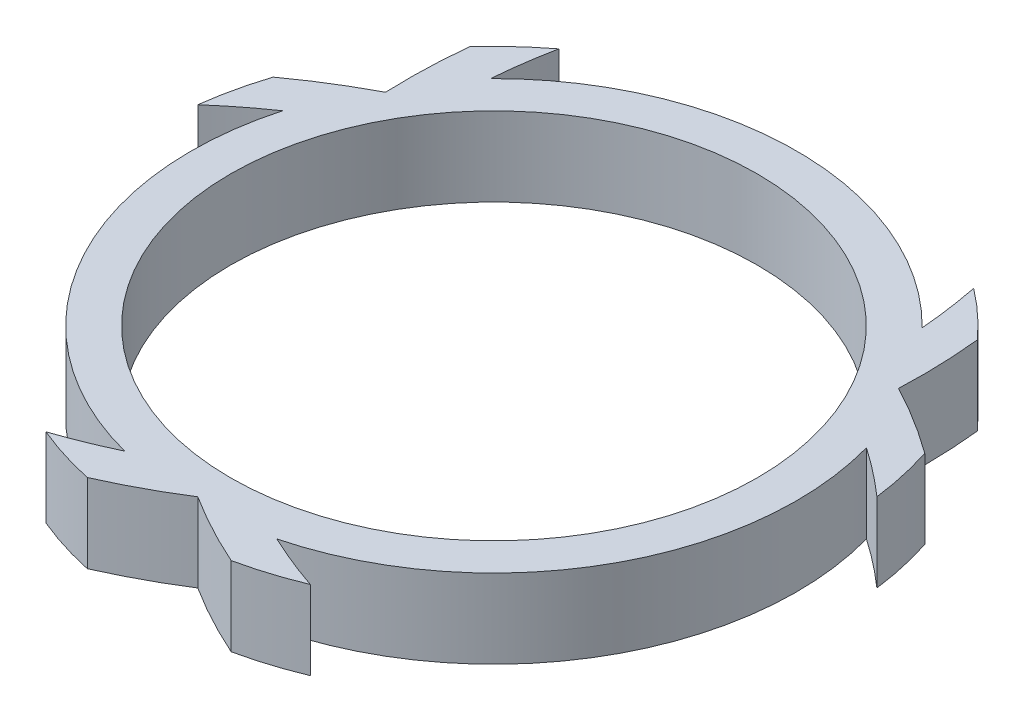
ISO-10303-21;
HEADER;
FILE_DESCRIPTION(('STEP AP214'),'2;1');
FILE_NAME('part.step','',(''),(''),'','','');
FILE_SCHEMA(('AUTOMOTIVE_DESIGN { 1 0 10303 214 1 1 1 1 }'));
ENDSEC;
DATA;
#1=APPLICATION_CONTEXT('core data for automotive mechanical design processes');
#2=APPLICATION_PROTOCOL_DEFINITION('international standard','automotive_design',2000,#1);
#3=PRODUCT_CONTEXT('',#1,'mechanical');
#4=PRODUCT('Part','Part','',(#3));
#5=PRODUCT_RELATED_PRODUCT_CATEGORY('part','',(#4));
#6=PRODUCT_DEFINITION_FORMATION('','',#4);
#7=PRODUCT_DEFINITION_CONTEXT('part definition',#1,'design');
#8=PRODUCT_DEFINITION('design','',#6,#7);
#9=PRODUCT_DEFINITION_SHAPE('','',#8);
#10=(LENGTH_UNIT() NAMED_UNIT(*) SI_UNIT(.MILLI.,.METRE.));
#11=(NAMED_UNIT(*) PLANE_ANGLE_UNIT() SI_UNIT($,.RADIAN.));
#12=(NAMED_UNIT(*) SI_UNIT($,.STERADIAN.) SOLID_ANGLE_UNIT());
#13=UNCERTAINTY_MEASURE_WITH_UNIT(LENGTH_MEASURE(1.E-05),#10,'distance_accuracy_value','');
#14=(GEOMETRIC_REPRESENTATION_CONTEXT(3) GLOBAL_UNCERTAINTY_ASSIGNED_CONTEXT((#13)) GLOBAL_UNIT_ASSIGNED_CONTEXT((#10,
#11,#12)) REPRESENTATION_CONTEXT('',''));
#15=CARTESIAN_POINT('',(0.,0.,0.));
#16=DIRECTION('',(0.,0.,1.));
#17=DIRECTION('',(1.,0.,0.));
#18=AXIS2_PLACEMENT_3D('',#15,#16,#17);
#19=CARTESIAN_POINT('',(-13.01,3.,-50.0940107675848));
#20=DIRECTION('',(0.,-1.,0.));
#21=DIRECTION('',(0.,0.,-1.));
#22=AXIS2_PLACEMENT_3D('',#19,#20,#21);
#23=PLANE('',#22);
#24=CARTESIAN_POINT('',(0.,3.,-63.0940107675848));
#25=DIRECTION('',(0.,1.,0.));
#26=DIRECTION('',(0.,0.,1.));
#27=AXIS2_PLACEMENT_3D('',#24,#25,#26);
#28=CIRCLE('',#27,11.5);
#29=CARTESIAN_POINT('',(11.08445734716,3.,-66.1574737294939));
#30=VERTEX_POINT('',#29);
#31=CARTESIAN_POINT('',(2.88919192501457,3.,-51.9628576368248));
#32=VERTEX_POINT('',#31);
#33=EDGE_CURVE('E47',#30,#32,#28,.F.);
#34=ORIENTED_EDGE('',*,*,#33,.T.);
#35=CARTESIAN_POINT('',(11.2583302491977,3.,-69.594010767585));
#36=DIRECTION('',(0.,1.,0.));
#37=DIRECTION('',(0.,0.,1.));
#38=AXIS2_PLACEMENT_3D('',#35,#36,#37);
#39=CIRCLE('',#38,19.5166604983954);
#40=CARTESIAN_POINT('',(5.01848841913951,3.,-51.1017310015453));
#41=VERTEX_POINT('',#40);
#42=EDGE_CURVE('E234',#32,#41,#39,.T.);
#43=ORIENTED_EDGE('',*,*,#42,.T.);
#44=CARTESIAN_POINT('',(0.,3.,-63.0940107675848));
#45=DIRECTION('',(0.,-1.,0.));
#46=DIRECTION('',(0.,0.,-1.));
#47=AXIS2_PLACEMENT_3D('',#44,#45,#46);
#48=CIRCLE('',#47,13.);
#49=CARTESIAN_POINT('',(2.73241138031824,3.,-50.3844109293245));
#50=VERTEX_POINT('',#49);
#51=EDGE_CURVE('E284',#50,#41,#48,.F.);
#52=ORIENTED_EDGE('',*,*,#51,.F.);
#53=CARTESIAN_POINT('',(11.2583302491977,3.,-69.594010767585));
#54=DIRECTION('',(0.,1.,0.));
#55=DIRECTION('',(0.,0.,1.));
#56=AXIS2_PLACEMENT_3D('',#53,#54,#55);
#57=CIRCLE('',#56,21.0166604983954);
#58=CARTESIAN_POINT('',(0.,3.,-51.8471795432562));
#59=VERTEX_POINT('',#58);
#60=EDGE_CURVE('E316',#59,#50,#57,.T.);
#61=ORIENTED_EDGE('',*,*,#60,.F.);
#62=CARTESIAN_POINT('',(-11.2583302491977,3.,-69.594010767585));
#63=DIRECTION('',(0.,1.,0.));
#64=DIRECTION('',(0.,0.,1.));
#65=AXIS2_PLACEMENT_3D('',#62,#63,#64);
#66=CIRCLE('',#65,21.0166604983954);
#67=CARTESIAN_POINT('',(-2.73241138031828,3.,-50.3844109293245));
#68=VERTEX_POINT('',#67);
#69=EDGE_CURVE('E297',#68,#59,#66,.T.);
#70=ORIENTED_EDGE('',*,*,#69,.F.);
#71=CARTESIAN_POINT('',(-5.01848841913956,3.,-51.1017310015452));
#72=VERTEX_POINT('',#71);
#73=EDGE_CURVE('E210',#72,#68,#48,.F.);
#74=ORIENTED_EDGE('',*,*,#73,.F.);
#75=CARTESIAN_POINT('',(-11.2583302491977,3.,-69.594010767585));
#76=DIRECTION('',(0.,1.,0.));
#77=DIRECTION('',(0.,0.,1.));
#78=AXIS2_PLACEMENT_3D('',#75,#76,#77);
#79=CIRCLE('',#78,19.5166604983954);
#80=CARTESIAN_POINT('',(-2.88919192501458,3.,-51.9628576368248));
#81=VERTEX_POINT('',#80);
#82=EDGE_CURVE('E255',#72,#81,#79,.T.);
#83=ORIENTED_EDGE('',*,*,#82,.T.);
#84=CARTESIAN_POINT('',(0.,3.,-63.0940107675848));
#85=DIRECTION('',(0.,1.,0.));
#86=DIRECTION('',(0.,0.,1.));
#87=AXIS2_PLACEMENT_3D('',#84,#85,#86);
#88=CIRCLE('',#87,11.4999999999999);
#89=CARTESIAN_POINT('',(-11.0844573471601,3.,-66.1574737294938));
#90=VERTEX_POINT('',#89);
#91=EDGE_CURVE('E217',#81,#90,#88,.F.);
#92=ORIENTED_EDGE('',*,*,#91,.T.);
#93=CARTESIAN_POINT('',(0.,3.,-50.094010767585));
#94=DIRECTION('',(0.,1.,0.));
#95=DIRECTION('',(0.,0.,1.));
#96=AXIS2_PLACEMENT_3D('',#93,#94,#95);
#97=CIRCLE('',#96,19.5166604983954);
#98=CARTESIAN_POINT('',(-12.8948631362501,3.,-64.7440121910322));
#99=VERTEX_POINT('',#98);
#100=EDGE_CURVE('E195',#90,#99,#97,.T.);
#101=ORIENTED_EDGE('',*,*,#100,.T.);
#102=CARTESIAN_POINT('',(-12.3730420220271,3.,-67.0824730177702));
#103=VERTEX_POINT('',#102);
#104=EDGE_CURVE('E206',#103,#99,#48,.F.);
#105=ORIENTED_EDGE('',*,*,#104,.F.);
#106=CARTESIAN_POINT('',(0.,3.,-50.094010767585));
#107=DIRECTION('',(0.,1.,0.));
#108=DIRECTION('',(0.,0.,1.));
#109=AXIS2_PLACEMENT_3D('',#106,#107,#108);
#110=CIRCLE('',#109,21.0166604983954);
#111=CARTESIAN_POINT('',(-9.74004155234485,3.,-68.7174263797494));
#112=VERTEX_POINT('',#111);
#113=EDGE_CURVE('E295',#112,#103,#110,.T.);
#114=ORIENTED_EDGE('',*,*,#113,.F.);
#115=CARTESIAN_POINT('',(11.2583302491977,3.,-69.594010767585));
#116=DIRECTION('',(0.,1.,0.));
#117=DIRECTION('',(0.,0.,1.));
#118=AXIS2_PLACEMENT_3D('',#115,#116,#117);
#119=CIRCLE('',#118,21.0166604983954);
#120=CARTESIAN_POINT('',(-9.64063064170916,3.,-71.8151483556601));
#121=VERTEX_POINT('',#120);
#122=EDGE_CURVE('E68',#121,#112,#119,.T.);
#123=ORIENTED_EDGE('',*,*,#122,.F.);
#124=CARTESIAN_POINT('',(-7.87637471711089,3.,-73.4362891101773));
#125=VERTEX_POINT('',#124);
#126=EDGE_CURVE('E211',#125,#121,#48,.F.);
#127=ORIENTED_EDGE('',*,*,#126,.F.);
#128=CARTESIAN_POINT('',(11.2583302491977,3.,-69.594010767585));
#129=DIRECTION('',(0.,1.,0.));
#130=DIRECTION('',(0.,0.,1.));
#131=AXIS2_PLACEMENT_3D('',#128,#129,#130);
#132=CIRCLE('',#131,19.5166604983954);
#133=CARTESIAN_POINT('',(-8.19526542214581,3.,-71.1617009364364));
#134=VERTEX_POINT('',#133);
#135=EDGE_CURVE('E218',#125,#134,#132,.T.);
#136=ORIENTED_EDGE('',*,*,#135,.T.);
#137=CARTESIAN_POINT('',(0.,3.,-63.0940107675848));
#138=DIRECTION('',(0.,1.,0.));
#139=DIRECTION('',(0.,0.,1.));
#140=AXIS2_PLACEMENT_3D('',#137,#138,#139);
#141=CIRCLE('',#140,11.5000000000001);
#142=CARTESIAN_POINT('',(8.19526542214578,3.,-71.1617009364363));
#143=VERTEX_POINT('',#142);
#144=EDGE_CURVE('E223',#134,#143,#141,.F.);
#145=ORIENTED_EDGE('',*,*,#144,.T.);
#146=CARTESIAN_POINT('',(-11.2583302491977,3.,-69.594010767585));
#147=DIRECTION('',(0.,1.,0.));
#148=DIRECTION('',(0.,0.,1.));
#149=AXIS2_PLACEMENT_3D('',#146,#147,#148);
#150=CIRCLE('',#149,19.5166604983954);
#151=CARTESIAN_POINT('',(7.87637471711086,3.,-73.4362891101772));
#152=VERTEX_POINT('',#151);
#153=EDGE_CURVE('E221',#143,#152,#150,.T.);
#154=ORIENTED_EDGE('',*,*,#153,.T.);
#155=CARTESIAN_POINT('',(9.64063064170913,3.,-71.81514835566));
#156=VERTEX_POINT('',#155);
#157=EDGE_CURVE('E262',#156,#152,#48,.F.);
#158=ORIENTED_EDGE('',*,*,#157,.F.);
#159=CARTESIAN_POINT('',(-11.2583302491977,3.,-69.594010767585));
#160=DIRECTION('',(0.,1.,0.));
#161=DIRECTION('',(0.,0.,1.));
#162=AXIS2_PLACEMENT_3D('',#159,#160,#161);
#163=CIRCLE('',#162,21.0166604983954);
#164=CARTESIAN_POINT('',(9.74004155234482,3.,-68.7174263797495));
#165=VERTEX_POINT('',#164);
#166=EDGE_CURVE('E293',#165,#156,#163,.T.);
#167=ORIENTED_EDGE('',*,*,#166,.F.);
#168=CARTESIAN_POINT('',(0.,3.,-50.094010767585));
#169=DIRECTION('',(0.,1.,0.));
#170=DIRECTION('',(0.,0.,1.));
#171=AXIS2_PLACEMENT_3D('',#168,#169,#170);
#172=CIRCLE('',#171,21.0166604983954);
#173=CARTESIAN_POINT('',(12.373042022027,3.,-67.0824730177702));
#174=VERTEX_POINT('',#173);
#175=EDGE_CURVE('E313',#174,#165,#172,.T.);
#176=ORIENTED_EDGE('',*,*,#175,.F.);
#177=CARTESIAN_POINT('',(12.89486313625,3.,-64.7440121910323));
#178=VERTEX_POINT('',#177);
#179=EDGE_CURVE('E279',#178,#174,#48,.F.);
#180=ORIENTED_EDGE('',*,*,#179,.F.);
#181=CARTESIAN_POINT('',(0.,3.,-50.094010767585));
#182=DIRECTION('',(0.,1.,0.));
#183=DIRECTION('',(0.,0.,1.));
#184=AXIS2_PLACEMENT_3D('',#181,#182,#183);
#185=CIRCLE('',#184,19.5166604983954);
#186=EDGE_CURVE('E237',#178,#30,#185,.T.);
#187=ORIENTED_EDGE('',*,*,#186,.T.);
#188=EDGE_LOOP('',(#34,#43,#52,#61,#70,#74,#83,#92,#101,#105,#114,#123,#127,#136,#145,#154,#158,
#167,#176,#180,#187));
#189=FACE_BOUND('',#188,.T.);
#190=CARTESIAN_POINT('',(0.,3.,-63.0940107675848));
#191=DIRECTION('',(0.,-1.,0.));
#192=DIRECTION('',(0.,0.,-1.));
#193=AXIS2_PLACEMENT_3D('',#190,#191,#192);
#194=CIRCLE('',#193,10.);
#195=CARTESIAN_POINT('',(0.,3.,-73.0940107675848));
#196=VERTEX_POINT('',#195);
#197=EDGE_CURVE('E278',#196,#196,#194,.T.);
#198=ORIENTED_EDGE('',*,*,#197,.F.);
#199=EDGE_LOOP('',(#198));
#200=FACE_BOUND('',#199,.T.);
#201=ADVANCED_FACE('F43',(#189,#200),#23,.T.);
#202=CARTESIAN_POINT('',(0.,-12.01,-63.0940107675848));
#203=DIRECTION('',(0.,1.,0.));
#204=DIRECTION('',(0.,0.,1.));
#205=AXIS2_PLACEMENT_3D('',#202,#203,#204);
#206=CYLINDRICAL_SURFACE('',#205,13.);
#207=DIRECTION('',(0.,1.,0.));
#208=VECTOR('',#207,1.);
#209=CARTESIAN_POINT('',(12.89486313625,-3.005,-64.7440121910323));
#210=LINE('',#209,#208);
#211=CARTESIAN_POINT('',(12.89486313625,6.,-64.7440121910323));
#212=VERTEX_POINT('',#211);
#213=EDGE_CURVE('E274',#178,#212,#210,.T.);
#214=ORIENTED_EDGE('',*,*,#213,.F.);
#215=ORIENTED_EDGE('',*,*,#179,.T.);
#216=DIRECTION('',(0.,1.,0.));
#217=VECTOR('',#216,1.);
#218=CARTESIAN_POINT('',(12.373042022027,-3.005,-67.0824730177702));
#219=LINE('',#218,#217);
#220=CARTESIAN_POINT('',(12.373042022027,6.,-67.0824730177702));
#221=VERTEX_POINT('',#220);
#222=EDGE_CURVE('E351',#174,#221,#219,.T.);
#223=ORIENTED_EDGE('',*,*,#222,.T.);
#224=CARTESIAN_POINT('',(0.,6.,-63.0940107675848));
#225=DIRECTION('',(0.,1.,0.));
#226=DIRECTION('',(0.,0.,1.));
#227=AXIS2_PLACEMENT_3D('',#224,#225,#226);
#228=CIRCLE('',#227,13.);
#229=EDGE_CURVE('E375',#212,#221,#228,.T.);
#230=ORIENTED_EDGE('',*,*,#229,.F.);
#231=EDGE_LOOP('',(#214,#215,#223,#230));
#232=FACE_BOUND('',#231,.T.);
#233=ADVANCED_FACE('F389',(#232),#206,.T.);
#234=CARTESIAN_POINT('',(0.,6.,-50.094010767585));
#235=DIRECTION('',(0.,-1.,0.));
#236=DIRECTION('',(0.,0.,-1.));
#237=AXIS2_PLACEMENT_3D('',#234,#235,#236);
#238=CYLINDRICAL_SURFACE('',#237,21.0166604983954);
#239=DIRECTION('',(0.,1.,0.));
#240=VECTOR('',#239,1.);
#241=CARTESIAN_POINT('',(-12.3730420220271,-3.005,-67.0824730177702));
#242=LINE('',#241,#240);
#243=CARTESIAN_POINT('',(-12.3730420220271,6.,-67.0824730177702));
#244=VERTEX_POINT('',#243);
#245=EDGE_CURVE('E209',#244,#103,#242,.F.);
#246=ORIENTED_EDGE('',*,*,#245,.F.);
#247=CARTESIAN_POINT('',(0.,6.,-50.094010767585));
#248=DIRECTION('',(0.,1.,0.));
#249=DIRECTION('',(0.,0.,1.));
#250=AXIS2_PLACEMENT_3D('',#247,#248,#249);
#251=CIRCLE('',#250,21.0166604983954);
#252=CARTESIAN_POINT('',(-9.74004155234485,6.,-68.7174263797494));
#253=VERTEX_POINT('',#252);
#254=EDGE_CURVE('E292',#253,#244,#251,.T.);
#255=ORIENTED_EDGE('',*,*,#254,.F.);
#256=DIRECTION('',(0.,-1.,0.));
#257=VECTOR('',#256,1.);
#258=CARTESIAN_POINT('',(-9.74004155234485,6.,-68.7174263797494));
#259=LINE('',#258,#257);
#260=EDGE_CURVE('E290',#253,#112,#259,.T.);
#261=ORIENTED_EDGE('',*,*,#260,.T.);
#262=ORIENTED_EDGE('',*,*,#113,.T.);
#263=EDGE_LOOP('',(#246,#255,#261,#262));
#264=FACE_BOUND('',#263,.T.);
#265=ADVANCED_FACE('F299',(#264),#238,.T.);
#266=CARTESIAN_POINT('',(0.,6.,-50.094010767585));
#267=DIRECTION('',(0.,-1.,0.));
#268=DIRECTION('',(0.,0.,-1.));
#269=AXIS2_PLACEMENT_3D('',#266,#267,#268);
#270=CYLINDRICAL_SURFACE('',#269,21.0166604983954);
#271=ORIENTED_EDGE('',*,*,#222,.F.);
#272=ORIENTED_EDGE('',*,*,#175,.T.);
#273=DIRECTION('',(0.,-1.,0.));
#274=VECTOR('',#273,1.);
#275=CARTESIAN_POINT('',(9.74004155234482,6.,-68.7174263797495));
#276=LINE('',#275,#274);
#277=CARTESIAN_POINT('',(9.74004155234482,6.,-68.7174263797495));
#278=VERTEX_POINT('',#277);
#279=EDGE_CURVE('E300',#278,#165,#276,.T.);
#280=ORIENTED_EDGE('',*,*,#279,.F.);
#281=CARTESIAN_POINT('',(0.,6.,-50.094010767585));
#282=DIRECTION('',(0.,1.,0.));
#283=DIRECTION('',(0.,0.,1.));
#284=AXIS2_PLACEMENT_3D('',#281,#282,#283);
#285=CIRCLE('',#284,21.0166604983954);
#286=EDGE_CURVE('E336',#221,#278,#285,.T.);
#287=ORIENTED_EDGE('',*,*,#286,.F.);
#288=EDGE_LOOP('',(#271,#272,#280,#287));
#289=FACE_BOUND('',#288,.T.);
#290=ADVANCED_FACE('F391',(#289),#270,.T.);
#291=CARTESIAN_POINT('',(-11.2583302491977,6.,-69.594010767585));
#292=DIRECTION('',(0.,-1.,0.));
#293=DIRECTION('',(0.,0.,-1.));
#294=AXIS2_PLACEMENT_3D('',#291,#292,#293);
#295=CYLINDRICAL_SURFACE('',#294,21.0166604983954);
#296=DIRECTION('',(0.,1.,0.));
#297=VECTOR('',#296,1.);
#298=CARTESIAN_POINT('',(-2.73241138031828,-3.005,-50.3844109293245));
#299=LINE('',#298,#297);
#300=CARTESIAN_POINT('',(-2.73241138031828,6.,-50.3844109293245));
#301=VERTEX_POINT('',#300);
#302=EDGE_CURVE('E325',#68,#301,#299,.T.);
#303=ORIENTED_EDGE('',*,*,#302,.F.);
#304=ORIENTED_EDGE('',*,*,#69,.T.);
#305=DIRECTION('',(0.,-1.,0.));
#306=VECTOR('',#305,1.);
#307=CARTESIAN_POINT('',(0.,6.,-51.8471795432562));
#308=LINE('',#307,#306);
#309=CARTESIAN_POINT('',(0.,6.,-51.8471795432562));
#310=VERTEX_POINT('',#309);
#311=EDGE_CURVE('E303',#310,#59,#308,.T.);
#312=ORIENTED_EDGE('',*,*,#311,.F.);
#313=CARTESIAN_POINT('',(-11.2583302491977,6.,-69.594010767585));
#314=DIRECTION('',(0.,1.,0.));
#315=DIRECTION('',(0.,0.,1.));
#316=AXIS2_PLACEMENT_3D('',#313,#314,#315);
#317=CIRCLE('',#316,21.0166604983954);
#318=EDGE_CURVE('E337',#301,#310,#317,.T.);
#319=ORIENTED_EDGE('',*,*,#318,.F.);
#320=EDGE_LOOP('',(#303,#304,#312,#319));
#321=FACE_BOUND('',#320,.T.);
#322=ADVANCED_FACE('F322',(#321),#295,.T.);
#323=DIRECTION('',(0.,1.,0.));
#324=VECTOR('',#323,1.);
#325=CARTESIAN_POINT('',(9.64063064170914,-3.005,-71.81514835566));
#326=LINE('',#325,#324);
#327=CARTESIAN_POINT('',(9.64063064170913,6.,-71.81514835566));
#328=VERTEX_POINT('',#327);
#329=EDGE_CURVE('E52',#328,#156,#326,.F.);
#330=ORIENTED_EDGE('',*,*,#329,.T.);
#331=ORIENTED_EDGE('',*,*,#157,.T.);
#332=DIRECTION('',(0.,1.,0.));
#333=VECTOR('',#332,1.);
#334=CARTESIAN_POINT('',(7.87637471711086,-3.005,-73.4362891101772));
#335=LINE('',#334,#333);
#336=CARTESIAN_POINT('',(7.87637471711086,6.,-73.4362891101772));
#337=VERTEX_POINT('',#336);
#338=EDGE_CURVE('E270',#337,#152,#335,.F.);
#339=ORIENTED_EDGE('',*,*,#338,.F.);
#340=EDGE_CURVE('E394',#328,#337,#228,.T.);
#341=ORIENTED_EDGE('',*,*,#340,.F.);
#342=EDGE_LOOP('',(#330,#331,#339,#341));
#343=FACE_BOUND('',#342,.T.);
#344=ADVANCED_FACE('F276',(#343),#206,.T.);
#345=DIRECTION('',(0.,1.,0.));
#346=VECTOR('',#345,1.);
#347=CARTESIAN_POINT('',(-7.87637471711089,-3.005,-73.4362891101773));
#348=LINE('',#347,#346);
#349=CARTESIAN_POINT('',(-7.87637471711089,6.,-73.4362891101773));
#350=VERTEX_POINT('',#349);
#351=EDGE_CURVE('E201',#125,#350,#348,.T.);
#352=ORIENTED_EDGE('',*,*,#351,.F.);
#353=ORIENTED_EDGE('',*,*,#126,.T.);
#354=DIRECTION('',(0.,1.,0.));
#355=VECTOR('',#354,1.);
#356=CARTESIAN_POINT('',(-9.64063064170917,-3.005,-71.8151483556601));
#357=LINE('',#356,#355);
#358=CARTESIAN_POINT('',(-9.64063064170916,6.,-71.8151483556601));
#359=VERTEX_POINT('',#358);
#360=EDGE_CURVE('E11',#121,#359,#357,.T.);
#361=ORIENTED_EDGE('',*,*,#360,.T.);
#362=EDGE_CURVE('E396',#350,#359,#228,.T.);
#363=ORIENTED_EDGE('',*,*,#362,.F.);
#364=EDGE_LOOP('',(#352,#353,#361,#363));
#365=FACE_BOUND('',#364,.T.);
#366=ADVANCED_FACE('F45',(#365),#206,.T.);
#367=ORIENTED_EDGE('',*,*,#245,.T.);
#368=ORIENTED_EDGE('',*,*,#104,.T.);
#369=DIRECTION('',(0.,1.,0.));
#370=VECTOR('',#369,1.);
#371=CARTESIAN_POINT('',(-12.8948631362501,-3.005,-64.7440121910322));
#372=LINE('',#371,#370);
#373=CARTESIAN_POINT('',(-12.8948631362501,6.,-64.7440121910322));
#374=VERTEX_POINT('',#373);
#375=EDGE_CURVE('E191',#374,#99,#372,.F.);
#376=ORIENTED_EDGE('',*,*,#375,.F.);
#377=EDGE_CURVE('E719',#244,#374,#228,.T.);
#378=ORIENTED_EDGE('',*,*,#377,.F.);
#379=EDGE_LOOP('',(#367,#368,#376,#378));
#380=FACE_BOUND('',#379,.T.);
#381=ADVANCED_FACE('F207',(#380),#206,.T.);
#382=DIRECTION('',(0.,1.,0.));
#383=VECTOR('',#382,1.);
#384=CARTESIAN_POINT('',(-5.01848841913956,-3.005,-51.1017310015452));
#385=LINE('',#384,#383);
#386=CARTESIAN_POINT('',(-5.01848841913956,6.,-51.1017310015452));
#387=VERTEX_POINT('',#386);
#388=EDGE_CURVE('E380',#72,#387,#385,.T.);
#389=ORIENTED_EDGE('',*,*,#388,.F.);
#390=ORIENTED_EDGE('',*,*,#73,.T.);
#391=ORIENTED_EDGE('',*,*,#302,.T.);
#392=EDGE_CURVE('E310',#387,#301,#228,.T.);
#393=ORIENTED_EDGE('',*,*,#392,.F.);
#394=EDGE_LOOP('',(#389,#390,#391,#393));
#395=FACE_BOUND('',#394,.T.);
#396=ADVANCED_FACE('F417',(#395),#206,.T.);
#397=CARTESIAN_POINT('',(0.,6.,-50.094010767585));
#398=DIRECTION('',(0.,-1.,0.));
#399=DIRECTION('',(0.,0.,-1.));
#400=AXIS2_PLACEMENT_3D('',#397,#398,#399);
#401=CYLINDRICAL_SURFACE('',#400,19.5166604983954);
#402=CARTESIAN_POINT('',(0.,6.,-50.094010767585));
#403=DIRECTION('',(0.,1.,0.));
#404=DIRECTION('',(0.,0.,1.));
#405=AXIS2_PLACEMENT_3D('',#402,#403,#404);
#406=CIRCLE('',#405,19.5166604983954);
#407=CARTESIAN_POINT('',(-11.0844573471601,6.,-66.1574737294938));
#408=VERTEX_POINT('',#407);
#409=EDGE_CURVE('E198',#408,#374,#406,.T.);
#410=ORIENTED_EDGE('',*,*,#409,.T.);
#411=ORIENTED_EDGE('',*,*,#375,.T.);
#412=ORIENTED_EDGE('',*,*,#100,.F.);
#413=DIRECTION('',(0.,-1.,0.));
#414=VECTOR('',#413,1.);
#415=CARTESIAN_POINT('',(-11.0844573471601,4.5,-66.1574737294938));
#416=LINE('',#415,#414);
#417=EDGE_CURVE('E363',#90,#408,#416,.F.);
#418=ORIENTED_EDGE('',*,*,#417,.T.);
#419=EDGE_LOOP('',(#410,#411,#412,#418));
#420=FACE_BOUND('',#419,.T.);
#421=ADVANCED_FACE('F193',(#420),#401,.F.);
#422=CARTESIAN_POINT('',(-5.62916512459886,6.,-59.844010767585));
#423=DIRECTION('',(0.,1.,0.));
#424=DIRECTION('',(0.,0.,1.));
#425=AXIS2_PLACEMENT_3D('',#422,#423,#424);
#426=PLANE('',#425);
#427=CARTESIAN_POINT('',(0.,6.,-63.0940107675848));
#428=DIRECTION('',(0.,1.,0.));
#429=DIRECTION('',(0.,0.,1.));
#430=AXIS2_PLACEMENT_3D('',#427,#428,#429);
#431=CIRCLE('',#430,10.);
#432=CARTESIAN_POINT('',(0.,6.,-53.0940107675848));
#433=VERTEX_POINT('',#432);
#434=EDGE_CURVE('E281',#433,#433,#431,.T.);
#435=ORIENTED_EDGE('',*,*,#434,.F.);
#436=EDGE_LOOP('',(#435));
#437=FACE_BOUND('',#436,.T.);
#438=CARTESIAN_POINT('',(11.2583302491977,6.,-69.594010767585));
#439=DIRECTION('',(0.,1.,0.));
#440=DIRECTION('',(0.,0.,1.));
#441=AXIS2_PLACEMENT_3D('',#438,#439,#440);
#442=CIRCLE('',#441,21.0166604983954);
#443=CARTESIAN_POINT('',(2.73241138031824,6.,-50.3844109293245));
#444=VERTEX_POINT('',#443);
#445=EDGE_CURVE('E331',#310,#444,#442,.T.);
#446=ORIENTED_EDGE('',*,*,#445,.T.);
#447=CARTESIAN_POINT('',(5.01848841913951,6.,-51.1017310015453));
#448=VERTEX_POINT('',#447);
#449=EDGE_CURVE('E202',#444,#448,#228,.T.);
#450=ORIENTED_EDGE('',*,*,#449,.T.);
#451=CARTESIAN_POINT('',(11.2583302491977,6.,-69.594010767585));
#452=DIRECTION('',(0.,1.,0.));
#453=DIRECTION('',(0.,0.,1.));
#454=AXIS2_PLACEMENT_3D('',#451,#452,#453);
#455=CIRCLE('',#454,19.5166604983954);
#456=CARTESIAN_POINT('',(2.88919192501458,6.,-51.9628576368248));
#457=VERTEX_POINT('',#456);
#458=EDGE_CURVE('E345',#457,#448,#455,.T.);
#459=ORIENTED_EDGE('',*,*,#458,.F.);
#460=CARTESIAN_POINT('',(0.,6.,-63.0940107675848));
#461=DIRECTION('',(0.,1.,0.));
#462=DIRECTION('',(0.,0.,1.));
#463=AXIS2_PLACEMENT_3D('',#460,#461,#462);
#464=CIRCLE('',#463,11.5);
#465=CARTESIAN_POINT('',(11.08445734716,6.,-66.1574737294939));
#466=VERTEX_POINT('',#465);
#467=EDGE_CURVE('E245',#457,#466,#464,.T.);
#468=ORIENTED_EDGE('',*,*,#467,.T.);
#469=CARTESIAN_POINT('',(0.,6.,-50.094010767585));
#470=DIRECTION('',(0.,1.,0.));
#471=DIRECTION('',(0.,0.,1.));
#472=AXIS2_PLACEMENT_3D('',#469,#470,#471);
#473=CIRCLE('',#472,19.5166604983954);
#474=EDGE_CURVE('E343',#212,#466,#473,.T.);
#475=ORIENTED_EDGE('',*,*,#474,.F.);
#476=ORIENTED_EDGE('',*,*,#229,.T.);
#477=ORIENTED_EDGE('',*,*,#286,.T.);
#478=CARTESIAN_POINT('',(-11.2583302491977,6.,-69.594010767585));
#479=DIRECTION('',(0.,1.,0.));
#480=DIRECTION('',(0.,0.,1.));
#481=AXIS2_PLACEMENT_3D('',#478,#479,#480);
#482=CIRCLE('',#481,21.0166604983954);
#483=EDGE_CURVE('E305',#278,#328,#482,.T.);
#484=ORIENTED_EDGE('',*,*,#483,.T.);
#485=ORIENTED_EDGE('',*,*,#340,.T.);
#486=CARTESIAN_POINT('',(-11.2583302491977,6.,-69.594010767585));
#487=DIRECTION('',(0.,1.,0.));
#488=DIRECTION('',(0.,0.,1.));
#489=AXIS2_PLACEMENT_3D('',#486,#487,#488);
#490=CIRCLE('',#489,19.5166604983954);
#491=CARTESIAN_POINT('',(8.19526542214578,6.,-71.1617009364363));
#492=VERTEX_POINT('',#491);
#493=EDGE_CURVE('E271',#492,#337,#490,.T.);
#494=ORIENTED_EDGE('',*,*,#493,.F.);
#495=CARTESIAN_POINT('',(0.,6.,-63.0940107675848));
#496=DIRECTION('',(0.,1.,0.));
#497=DIRECTION('',(0.,0.,1.));
#498=AXIS2_PLACEMENT_3D('',#495,#496,#497);
#499=CIRCLE('',#498,11.5000000000001);
#500=CARTESIAN_POINT('',(-8.19526542214581,6.,-71.1617009364364));
#501=VERTEX_POINT('',#500);
#502=EDGE_CURVE('E357',#492,#501,#499,.T.);
#503=ORIENTED_EDGE('',*,*,#502,.T.);
#504=CARTESIAN_POINT('',(11.2583302491977,6.,-69.594010767585));
#505=DIRECTION('',(0.,1.,0.));
#506=DIRECTION('',(0.,0.,1.));
#507=AXIS2_PLACEMENT_3D('',#504,#505,#506);
#508=CIRCLE('',#507,19.5166604983954);
#509=EDGE_CURVE('E348',#350,#501,#508,.T.);
#510=ORIENTED_EDGE('',*,*,#509,.F.);
#511=ORIENTED_EDGE('',*,*,#362,.T.);
#512=CARTESIAN_POINT('',(11.2583302491977,6.,-69.594010767585));
#513=DIRECTION('',(0.,1.,0.));
#514=DIRECTION('',(0.,0.,1.));
#515=AXIS2_PLACEMENT_3D('',#512,#513,#514);
#516=CIRCLE('',#515,21.0166604983954);
#517=EDGE_CURVE('E60',#359,#253,#516,.T.);
#518=ORIENTED_EDGE('',*,*,#517,.T.);
#519=ORIENTED_EDGE('',*,*,#254,.T.);
#520=ORIENTED_EDGE('',*,*,#377,.T.);
#521=ORIENTED_EDGE('',*,*,#409,.F.);
#522=CARTESIAN_POINT('',(0.,6.,-63.0940107675848));
#523=DIRECTION('',(0.,1.,0.));
#524=DIRECTION('',(0.,0.,1.));
#525=AXIS2_PLACEMENT_3D('',#522,#523,#524);
#526=CIRCLE('',#525,11.4999999999999);
#527=CARTESIAN_POINT('',(-2.88919192501458,6.,-51.9628576368248));
#528=VERTEX_POINT('',#527);
#529=EDGE_CURVE('E360',#408,#528,#526,.T.);
#530=ORIENTED_EDGE('',*,*,#529,.T.);
#531=CARTESIAN_POINT('',(-11.2583302491977,6.,-69.594010767585));
#532=DIRECTION('',(0.,1.,0.));
#533=DIRECTION('',(0.,0.,1.));
#534=AXIS2_PLACEMENT_3D('',#531,#532,#533);
#535=CIRCLE('',#534,19.5166604983954);
#536=EDGE_CURVE('E249',#387,#528,#535,.T.);
#537=ORIENTED_EDGE('',*,*,#536,.F.);
#538=ORIENTED_EDGE('',*,*,#392,.T.);
#539=ORIENTED_EDGE('',*,*,#318,.T.);
#540=EDGE_LOOP('',(#446,#450,#459,#468,#475,#476,#477,#484,#485,#494,#503,#510,#511,#518,#519,
#520,#521,#530,#537,#538,#539));
#541=FACE_BOUND('',#540,.T.);
#542=ADVANCED_FACE('F374',(#437,#541),#426,.T.);
#543=CARTESIAN_POINT('',(-11.2583302491977,6.,-69.594010767585));
#544=DIRECTION('',(0.,-1.,0.));
#545=DIRECTION('',(0.,0.,-1.));
#546=AXIS2_PLACEMENT_3D('',#543,#544,#545);
#547=CYLINDRICAL_SURFACE('',#546,19.5166604983954);
#548=ORIENTED_EDGE('',*,*,#82,.F.);
#549=ORIENTED_EDGE('',*,*,#388,.T.);
#550=ORIENTED_EDGE('',*,*,#536,.T.);
#551=DIRECTION('',(0.,-1.,0.));
#552=VECTOR('',#551,1.);
#553=CARTESIAN_POINT('',(-2.88919192501458,4.5,-51.9628576368248));
#554=LINE('',#553,#552);
#555=EDGE_CURVE('E365',#528,#81,#554,.T.);
#556=ORIENTED_EDGE('',*,*,#555,.T.);
#557=EDGE_LOOP('',(#548,#549,#550,#556));
#558=FACE_BOUND('',#557,.T.);
#559=ADVANCED_FACE('F430',(#558),#547,.F.);
#560=CARTESIAN_POINT('',(0.,6.,-63.0940107675848));
#561=DIRECTION('',(0.,-1.,0.));
#562=DIRECTION('',(0.,0.,-1.));
#563=AXIS2_PLACEMENT_3D('',#560,#561,#562);
#564=CYLINDRICAL_SURFACE('',#563,11.4999999999999);
#565=ORIENTED_EDGE('',*,*,#555,.F.);
#566=ORIENTED_EDGE('',*,*,#529,.F.);
#567=ORIENTED_EDGE('',*,*,#417,.F.);
#568=ORIENTED_EDGE('',*,*,#91,.F.);
#569=EDGE_LOOP('',(#565,#566,#567,#568));
#570=FACE_BOUND('',#569,.T.);
#571=ADVANCED_FACE('F435',(#570),#564,.T.);
#572=CARTESIAN_POINT('',(11.2583302491977,6.,-69.594010767585));
#573=DIRECTION('',(0.,-1.,0.));
#574=DIRECTION('',(0.,0.,-1.));
#575=AXIS2_PLACEMENT_3D('',#572,#573,#574);
#576=CYLINDRICAL_SURFACE('',#575,19.5166604983954);
#577=ORIENTED_EDGE('',*,*,#135,.F.);
#578=ORIENTED_EDGE('',*,*,#351,.T.);
#579=ORIENTED_EDGE('',*,*,#509,.T.);
#580=DIRECTION('',(0.,-1.,0.));
#581=VECTOR('',#580,1.);
#582=CARTESIAN_POINT('',(-8.19526542214581,4.5,-71.1617009364364));
#583=LINE('',#582,#581);
#584=EDGE_CURVE('E367',#501,#134,#583,.T.);
#585=ORIENTED_EDGE('',*,*,#584,.T.);
#586=EDGE_LOOP('',(#577,#578,#579,#585));
#587=FACE_BOUND('',#586,.T.);
#588=ADVANCED_FACE('F495',(#587),#576,.F.);
#589=CARTESIAN_POINT('',(-11.2583302491977,6.,-69.594010767585));
#590=DIRECTION('',(0.,-1.,0.));
#591=DIRECTION('',(0.,0.,-1.));
#592=AXIS2_PLACEMENT_3D('',#589,#590,#591);
#593=CYLINDRICAL_SURFACE('',#592,19.5166604983954);
#594=ORIENTED_EDGE('',*,*,#493,.T.);
#595=ORIENTED_EDGE('',*,*,#338,.T.);
#596=ORIENTED_EDGE('',*,*,#153,.F.);
#597=DIRECTION('',(0.,-1.,0.));
#598=VECTOR('',#597,1.);
#599=CARTESIAN_POINT('',(8.19526542214578,4.5,-71.1617009364363));
#600=LINE('',#599,#598);
#601=EDGE_CURVE('E267',#143,#492,#600,.F.);
#602=ORIENTED_EDGE('',*,*,#601,.T.);
#603=EDGE_LOOP('',(#594,#595,#596,#602));
#604=FACE_BOUND('',#603,.T.);
#605=ADVANCED_FACE('F266',(#604),#593,.F.);
#606=CARTESIAN_POINT('',(0.,6.,-63.0940107675848));
#607=DIRECTION('',(0.,-1.,0.));
#608=DIRECTION('',(0.,0.,-1.));
#609=AXIS2_PLACEMENT_3D('',#606,#607,#608);
#610=CYLINDRICAL_SURFACE('',#609,11.5000000000001);
#611=ORIENTED_EDGE('',*,*,#601,.F.);
#612=ORIENTED_EDGE('',*,*,#144,.F.);
#613=ORIENTED_EDGE('',*,*,#584,.F.);
#614=ORIENTED_EDGE('',*,*,#502,.F.);
#615=EDGE_LOOP('',(#611,#612,#613,#614));
#616=FACE_BOUND('',#615,.T.);
#617=ADVANCED_FACE('F416',(#616),#610,.T.);
#618=DIRECTION('',(0.,1.,0.));
#619=VECTOR('',#618,1.);
#620=CARTESIAN_POINT('',(2.73241138031824,-3.005,-50.3844109293245));
#621=LINE('',#620,#619);
#622=EDGE_CURVE('E333',#444,#50,#621,.F.);
#623=ORIENTED_EDGE('',*,*,#622,.T.);
#624=ORIENTED_EDGE('',*,*,#51,.T.);
#625=DIRECTION('',(0.,1.,0.));
#626=VECTOR('',#625,1.);
#627=CARTESIAN_POINT('',(5.01848841913951,-3.005,-51.1017310015453));
#628=LINE('',#627,#626);
#629=EDGE_CURVE('E253',#448,#41,#628,.F.);
#630=ORIENTED_EDGE('',*,*,#629,.F.);
#631=ORIENTED_EDGE('',*,*,#449,.F.);
#632=EDGE_LOOP('',(#623,#624,#630,#631));
#633=FACE_BOUND('',#632,.T.);
#634=ADVANCED_FACE('F379',(#633),#206,.T.);
#635=CARTESIAN_POINT('',(11.2583302491977,6.,-69.594010767585));
#636=DIRECTION('',(0.,-1.,0.));
#637=DIRECTION('',(0.,0.,-1.));
#638=AXIS2_PLACEMENT_3D('',#635,#636,#637);
#639=CYLINDRICAL_SURFACE('',#638,21.0166604983954);
#640=ORIENTED_EDGE('',*,*,#622,.F.);
#641=ORIENTED_EDGE('',*,*,#445,.F.);
#642=ORIENTED_EDGE('',*,*,#311,.T.);
#643=ORIENTED_EDGE('',*,*,#60,.T.);
#644=EDGE_LOOP('',(#640,#641,#642,#643));
#645=FACE_BOUND('',#644,.T.);
#646=ADVANCED_FACE('F330',(#645),#639,.T.);
#647=CARTESIAN_POINT('',(-11.2583302491977,6.,-69.594010767585));
#648=DIRECTION('',(0.,-1.,0.));
#649=DIRECTION('',(0.,0.,-1.));
#650=AXIS2_PLACEMENT_3D('',#647,#648,#649);
#651=CYLINDRICAL_SURFACE('',#650,21.0166604983954);
#652=ORIENTED_EDGE('',*,*,#329,.F.);
#653=ORIENTED_EDGE('',*,*,#483,.F.);
#654=ORIENTED_EDGE('',*,*,#279,.T.);
#655=ORIENTED_EDGE('',*,*,#166,.T.);
#656=EDGE_LOOP('',(#652,#653,#654,#655));
#657=FACE_BOUND('',#656,.T.);
#658=ADVANCED_FACE('F397',(#657),#651,.T.);
#659=CARTESIAN_POINT('',(11.2583302491977,6.,-69.594010767585));
#660=DIRECTION('',(0.,-1.,0.));
#661=DIRECTION('',(0.,0.,-1.));
#662=AXIS2_PLACEMENT_3D('',#659,#660,#661);
#663=CYLINDRICAL_SURFACE('',#662,21.0166604983954);
#664=ORIENTED_EDGE('',*,*,#360,.F.);
#665=ORIENTED_EDGE('',*,*,#122,.T.);
#666=ORIENTED_EDGE('',*,*,#260,.F.);
#667=ORIENTED_EDGE('',*,*,#517,.F.);
#668=EDGE_LOOP('',(#664,#665,#666,#667));
#669=FACE_BOUND('',#668,.T.);
#670=ADVANCED_FACE('F288',(#669),#663,.T.);
#671=CARTESIAN_POINT('',(0.,6.,-63.0940107675848));
#672=DIRECTION('',(0.,-1.,0.));
#673=DIRECTION('',(0.,0.,-1.));
#674=AXIS2_PLACEMENT_3D('',#671,#672,#673);
#675=CYLINDRICAL_SURFACE('',#674,10.);
#676=ORIENTED_EDGE('',*,*,#434,.T.);
#677=EDGE_LOOP('',(#676));
#678=FACE_BOUND('',#677,.T.);
#679=ORIENTED_EDGE('',*,*,#197,.T.);
#680=EDGE_LOOP('',(#679));
#681=FACE_BOUND('',#680,.T.);
#682=ADVANCED_FACE('F404',(#678,#681),#675,.F.);
#683=CARTESIAN_POINT('',(0.,6.,-50.094010767585));
#684=DIRECTION('',(0.,-1.,0.));
#685=DIRECTION('',(0.,0.,-1.));
#686=AXIS2_PLACEMENT_3D('',#683,#684,#685);
#687=CYLINDRICAL_SURFACE('',#686,19.5166604983954);
#688=ORIENTED_EDGE('',*,*,#186,.F.);
#689=ORIENTED_EDGE('',*,*,#213,.T.);
#690=ORIENTED_EDGE('',*,*,#474,.T.);
#691=DIRECTION('',(0.,-1.,0.));
#692=VECTOR('',#691,1.);
#693=CARTESIAN_POINT('',(11.08445734716,4.5,-66.1574737294939));
#694=LINE('',#693,#692);
#695=EDGE_CURVE('E242',#466,#30,#694,.T.);
#696=ORIENTED_EDGE('',*,*,#695,.T.);
#697=EDGE_LOOP('',(#688,#689,#690,#696));
#698=FACE_BOUND('',#697,.T.);
#699=ADVANCED_FACE('F370',(#698),#687,.F.);
#700=CARTESIAN_POINT('',(11.2583302491977,6.,-69.594010767585));
#701=DIRECTION('',(0.,-1.,0.));
#702=DIRECTION('',(0.,0.,-1.));
#703=AXIS2_PLACEMENT_3D('',#700,#701,#702);
#704=CYLINDRICAL_SURFACE('',#703,19.5166604983954);
#705=ORIENTED_EDGE('',*,*,#458,.T.);
#706=ORIENTED_EDGE('',*,*,#629,.T.);
#707=ORIENTED_EDGE('',*,*,#42,.F.);
#708=DIRECTION('',(0.,-1.,0.));
#709=VECTOR('',#708,1.);
#710=CARTESIAN_POINT('',(2.88919192501457,4.5,-51.9628576368248));
#711=LINE('',#710,#709);
#712=EDGE_CURVE('E244',#32,#457,#711,.F.);
#713=ORIENTED_EDGE('',*,*,#712,.T.);
#714=EDGE_LOOP('',(#705,#706,#707,#713));
#715=FACE_BOUND('',#714,.T.);
#716=ADVANCED_FACE('F251',(#715),#704,.F.);
#717=CARTESIAN_POINT('',(0.,6.,-63.0940107675848));
#718=DIRECTION('',(0.,-1.,0.));
#719=DIRECTION('',(0.,0.,-1.));
#720=AXIS2_PLACEMENT_3D('',#717,#718,#719);
#721=CYLINDRICAL_SURFACE('',#720,11.5);
#722=ORIENTED_EDGE('',*,*,#712,.F.);
#723=ORIENTED_EDGE('',*,*,#33,.F.);
#724=ORIENTED_EDGE('',*,*,#695,.F.);
#725=ORIENTED_EDGE('',*,*,#467,.F.);
#726=EDGE_LOOP('',(#722,#723,#724,#725));
#727=FACE_BOUND('',#726,.T.);
#728=ADVANCED_FACE('F240',(#727),#721,.T.);
#729=CLOSED_SHELL('',(#201,#233,#265,#290,#322,#344,#366,#381,#396,#421,#542,#559,#571,#588,
#605,#617,#634,#646,#658,#670,#682,#699,#716,#728));
#730=MANIFOLD_SOLID_BREP('B2',#729);
#731=ADVANCED_BREP_SHAPE_REPRESENTATION('',(#18,#730),#14);
#732=SHAPE_DEFINITION_REPRESENTATION(#9,#731);
ENDSEC;
END-ISO-10303-21;
